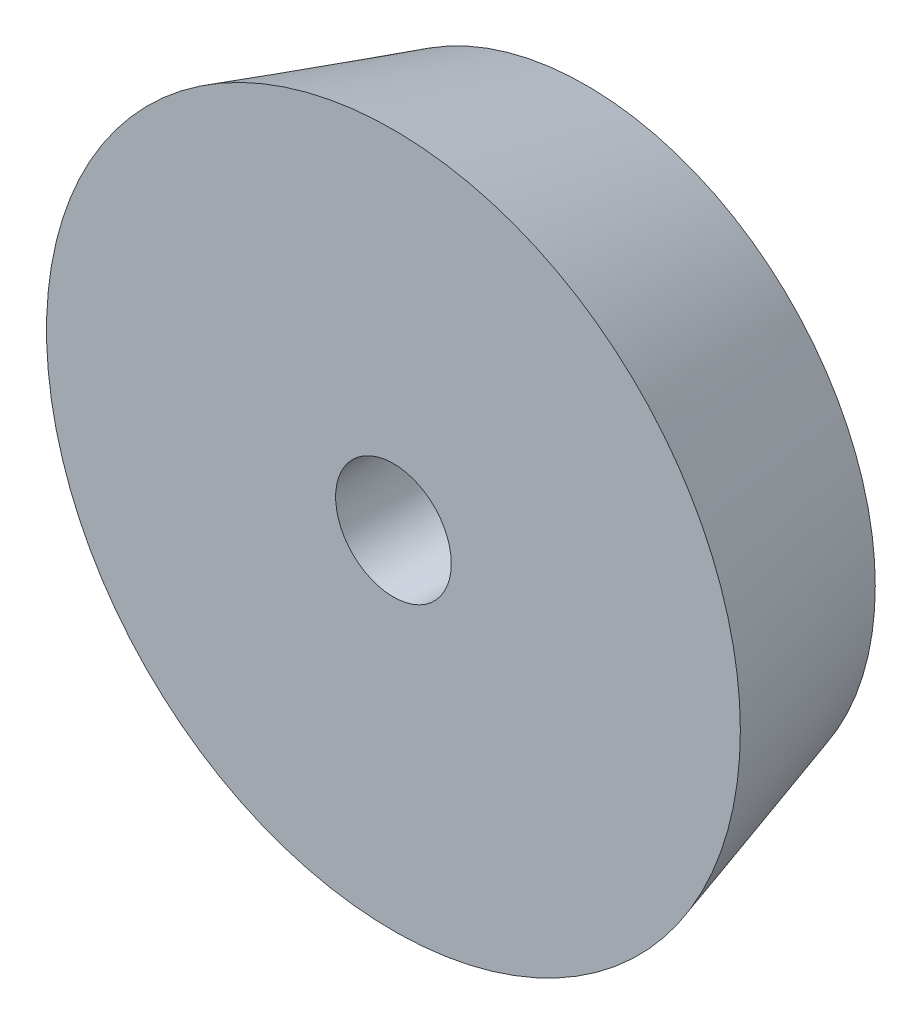
ISO-10303-21;
HEADER;
FILE_DESCRIPTION(('STEP AP214'),'2;1');
FILE_NAME('part.step','',(''),(''),'','','');
FILE_SCHEMA(('AUTOMOTIVE_DESIGN { 1 0 10303 214 1 1 1 1 }'));
ENDSEC;
DATA;
#1=APPLICATION_CONTEXT('core data for automotive mechanical design processes');
#2=APPLICATION_PROTOCOL_DEFINITION('international standard','automotive_design',2000,#1);
#3=PRODUCT_CONTEXT('',#1,'mechanical');
#4=PRODUCT('Part','Part','',(#3));
#5=PRODUCT_RELATED_PRODUCT_CATEGORY('part','',(#4));
#6=PRODUCT_DEFINITION_FORMATION('','',#4);
#7=PRODUCT_DEFINITION_CONTEXT('part definition',#1,'design');
#8=PRODUCT_DEFINITION('design','',#6,#7);
#9=PRODUCT_DEFINITION_SHAPE('','',#8);
#10=(LENGTH_UNIT() NAMED_UNIT(*) SI_UNIT(.MILLI.,.METRE.));
#11=(NAMED_UNIT(*) PLANE_ANGLE_UNIT() SI_UNIT($,.RADIAN.));
#12=(NAMED_UNIT(*) SI_UNIT($,.STERADIAN.) SOLID_ANGLE_UNIT());
#13=UNCERTAINTY_MEASURE_WITH_UNIT(LENGTH_MEASURE(1.E-05),#10,'distance_accuracy_value','');
#14=(GEOMETRIC_REPRESENTATION_CONTEXT(3) GLOBAL_UNCERTAINTY_ASSIGNED_CONTEXT((#13)) GLOBAL_UNIT_ASSIGNED_CONTEXT((#10,
#11,#12)) REPRESENTATION_CONTEXT('',''));
#15=CARTESIAN_POINT('',(0.,0.,0.));
#16=DIRECTION('',(0.,0.,1.));
#17=DIRECTION('',(1.,0.,0.));
#18=AXIS2_PLACEMENT_3D('',#15,#16,#17);
#19=CARTESIAN_POINT('',(0.,0.,0.));
#20=DIRECTION('',(0.,0.,1.));
#21=DIRECTION('',(1.,0.,0.));
#22=AXIS2_PLACEMENT_3D('',#19,#20,#21);
#23=CYLINDRICAL_SURFACE('',#22,1.5);
#24=CARTESIAN_POINT('',(0.,0.,0.));
#25=DIRECTION('',(0.,0.,1.));
#26=DIRECTION('',(1.,0.,0.));
#27=AXIS2_PLACEMENT_3D('',#24,#25,#26);
#28=CIRCLE('',#27,1.5);
#29=CARTESIAN_POINT('',(1.5,0.,0.));
#30=VERTEX_POINT('',#29);
#31=EDGE_CURVE('E40',#30,#30,#28,.T.);
#32=ORIENTED_EDGE('',*,*,#31,.T.);
#33=EDGE_LOOP('',(#32));
#34=FACE_BOUND('',#33,.T.);
#35=CARTESIAN_POINT('',(0.,0.,-3.));
#36=DIRECTION('',(0.,0.,-1.));
#37=DIRECTION('',(-1.,0.,0.));
#38=AXIS2_PLACEMENT_3D('',#35,#36,#37);
#39=CIRCLE('',#38,1.5);
#40=CARTESIAN_POINT('',(-1.5,0.,-3.));
#41=VERTEX_POINT('',#40);
#42=EDGE_CURVE('E36',#41,#41,#39,.F.);
#43=ORIENTED_EDGE('',*,*,#42,.F.);
#44=EDGE_LOOP('',(#43));
#45=FACE_BOUND('',#44,.T.);
#46=ADVANCED_FACE('F32',(#34,#45),#23,.F.);
#47=CARTESIAN_POINT('',(0.,0.,-5.));
#48=DIRECTION('',(0.,0.,1.));
#49=DIRECTION('',(1.,0.,0.));
#50=AXIS2_PLACEMENT_3D('',#47,#48,#49);
#51=CONICAL_SURFACE('',#50,7.5,0.291456794477867);
#52=CARTESIAN_POINT('',(0.,0.,0.));
#53=DIRECTION('',(0.,0.,1.));
#54=DIRECTION('',(1.,0.,0.));
#55=AXIS2_PLACEMENT_3D('',#52,#53,#54);
#56=CIRCLE('',#55,9.);
#57=CARTESIAN_POINT('',(9.,0.,0.));
#58=VERTEX_POINT('',#57);
#59=EDGE_CURVE('E44',#58,#58,#56,.T.);
#60=ORIENTED_EDGE('',*,*,#59,.F.);
#61=EDGE_LOOP('',(#60));
#62=FACE_BOUND('',#61,.T.);
#63=CARTESIAN_POINT('',(0.,0.,-5.));
#64=DIRECTION('',(0.,0.,1.));
#65=DIRECTION('',(1.,0.,0.));
#66=AXIS2_PLACEMENT_3D('',#63,#64,#65);
#67=CIRCLE('',#66,7.5);
#68=CARTESIAN_POINT('',(7.5,0.,-5.));
#69=VERTEX_POINT('',#68);
#70=EDGE_CURVE('E10',#69,#69,#67,.T.);
#71=ORIENTED_EDGE('',*,*,#70,.T.);
#72=EDGE_LOOP('',(#71));
#73=FACE_BOUND('',#72,.T.);
#74=ADVANCED_FACE('F34',(#62,#73),#51,.T.);
#75=CARTESIAN_POINT('',(0.,0.,-5.));
#76=DIRECTION('',(0.,0.,1.));
#77=DIRECTION('',(1.,0.,0.));
#78=AXIS2_PLACEMENT_3D('',#75,#76,#77);
#79=PLANE('',#78);
#80=CARTESIAN_POINT('',(0.,0.,-5.));
#81=DIRECTION('',(0.,0.,-1.));
#82=DIRECTION('',(-1.,0.,0.));
#83=AXIS2_PLACEMENT_3D('',#80,#81,#82);
#84=CIRCLE('',#83,4.5);
#85=CARTESIAN_POINT('',(-4.5,0.,-5.));
#86=VERTEX_POINT('',#85);
#87=EDGE_CURVE('E49',#86,#86,#84,.T.);
#88=ORIENTED_EDGE('',*,*,#87,.F.);
#89=EDGE_LOOP('',(#88));
#90=FACE_BOUND('',#89,.T.);
#91=ORIENTED_EDGE('',*,*,#70,.F.);
#92=EDGE_LOOP('',(#91));
#93=FACE_BOUND('',#92,.T.);
#94=ADVANCED_FACE('F67',(#90,#93),#79,.F.);
#95=CARTESIAN_POINT('',(0.,0.,0.));
#96=DIRECTION('',(0.,0.,1.));
#97=DIRECTION('',(1.,0.,0.));
#98=AXIS2_PLACEMENT_3D('',#95,#96,#97);
#99=PLANE('',#98);
#100=ORIENTED_EDGE('',*,*,#59,.T.);
#101=EDGE_LOOP('',(#100));
#102=FACE_BOUND('',#101,.T.);
#103=ORIENTED_EDGE('',*,*,#31,.F.);
#104=EDGE_LOOP('',(#103));
#105=FACE_BOUND('',#104,.T.);
#106=ADVANCED_FACE('F70',(#102,#105),#99,.T.);
#107=CARTESIAN_POINT('',(0.,0.,-3.));
#108=DIRECTION('',(0.,0.,-1.));
#109=DIRECTION('',(-1.,0.,0.));
#110=AXIS2_PLACEMENT_3D('',#107,#108,#109);
#111=PLANE('',#110);
#112=CARTESIAN_POINT('',(0.,0.,-3.));
#113=DIRECTION('',(0.,0.,-1.));
#114=DIRECTION('',(-1.,0.,0.));
#115=AXIS2_PLACEMENT_3D('',#112,#113,#114);
#116=CIRCLE('',#115,4.5);
#117=CARTESIAN_POINT('',(-4.5,0.,-3.));
#118=VERTEX_POINT('',#117);
#119=EDGE_CURVE('E52',#118,#118,#116,.T.);
#120=ORIENTED_EDGE('',*,*,#119,.T.);
#121=EDGE_LOOP('',(#120));
#122=FACE_BOUND('',#121,.T.);
#123=ORIENTED_EDGE('',*,*,#42,.T.);
#124=EDGE_LOOP('',(#123));
#125=FACE_BOUND('',#124,.T.);
#126=ADVANCED_FACE('F59',(#122,#125),#111,.T.);
#127=CARTESIAN_POINT('',(0.,0.,-3.));
#128=DIRECTION('',(0.,0.,-1.));
#129=DIRECTION('',(-1.,0.,0.));
#130=AXIS2_PLACEMENT_3D('',#127,#128,#129);
#131=CYLINDRICAL_SURFACE('',#130,4.5);
#132=ORIENTED_EDGE('',*,*,#119,.F.);
#133=EDGE_LOOP('',(#132));
#134=FACE_BOUND('',#133,.T.);
#135=ORIENTED_EDGE('',*,*,#87,.T.);
#136=EDGE_LOOP('',(#135));
#137=FACE_BOUND('',#136,.T.);
#138=ADVANCED_FACE('F81',(#134,#137),#131,.F.);
#139=CLOSED_SHELL('',(#46,#74,#94,#106,#126,#138));
#140=MANIFOLD_SOLID_BREP('B2',#139);
#141=ADVANCED_BREP_SHAPE_REPRESENTATION('',(#18,#140),#14);
#142=SHAPE_DEFINITION_REPRESENTATION(#9,#141);
ENDSEC;
END-ISO-10303-21;
